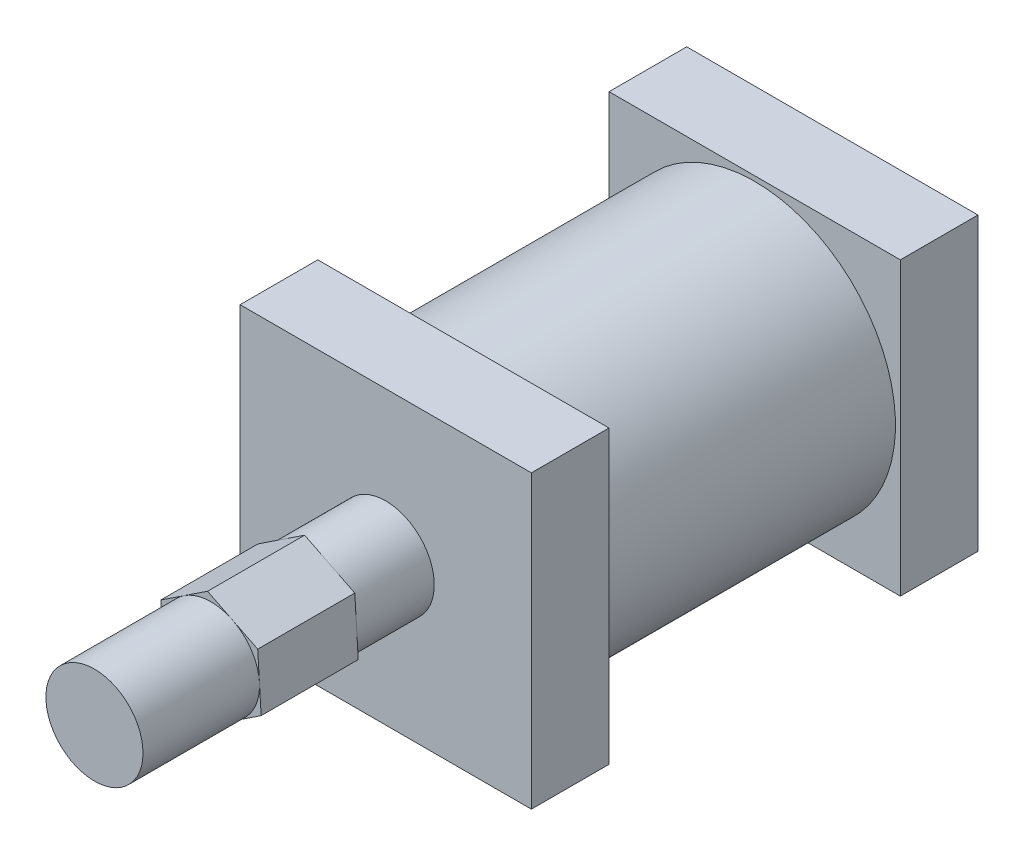
ISO-10303-21;
HEADER;
FILE_DESCRIPTION(('STEP AP214'),'2;1');
FILE_NAME('part.step','',(''),(''),'','','');
FILE_SCHEMA(('AUTOMOTIVE_DESIGN { 1 0 10303 214 1 1 1 1 }'));
ENDSEC;
DATA;
#1=APPLICATION_CONTEXT('core data for automotive mechanical design processes');
#2=APPLICATION_PROTOCOL_DEFINITION('international standard','automotive_design',2000,#1);
#3=PRODUCT_CONTEXT('',#1,'mechanical');
#4=PRODUCT('Part','Part','',(#3));
#5=PRODUCT_RELATED_PRODUCT_CATEGORY('part','',(#4));
#6=PRODUCT_DEFINITION_FORMATION('','',#4);
#7=PRODUCT_DEFINITION_CONTEXT('part definition',#1,'design');
#8=PRODUCT_DEFINITION('design','',#6,#7);
#9=PRODUCT_DEFINITION_SHAPE('','',#8);
#10=(LENGTH_UNIT() NAMED_UNIT(*) SI_UNIT(.MILLI.,.METRE.));
#11=(NAMED_UNIT(*) PLANE_ANGLE_UNIT() SI_UNIT($,.RADIAN.));
#12=(NAMED_UNIT(*) SI_UNIT($,.STERADIAN.) SOLID_ANGLE_UNIT());
#13=UNCERTAINTY_MEASURE_WITH_UNIT(LENGTH_MEASURE(1.E-05),#10,'distance_accuracy_value','');
#14=(GEOMETRIC_REPRESENTATION_CONTEXT(3) GLOBAL_UNCERTAINTY_ASSIGNED_CONTEXT((#13)) GLOBAL_UNIT_ASSIGNED_CONTEXT((#10,
#11,#12)) REPRESENTATION_CONTEXT('',''));
#15=CARTESIAN_POINT('',(0.,0.,0.));
#16=DIRECTION('',(0.,0.,1.));
#17=DIRECTION('',(1.,0.,0.));
#18=AXIS2_PLACEMENT_3D('',#15,#16,#17);
#19=CARTESIAN_POINT('',(0.,0.,81.28));
#20=DIRECTION('',(0.,0.,1.));
#21=DIRECTION('',(1.,0.,0.));
#22=AXIS2_PLACEMENT_3D('',#19,#20,#21);
#23=PLANE('',#22);
#24=CARTESIAN_POINT('',(19.05,19.05,81.28));
#25=DIRECTION('',(0.,0.,1.));
#26=DIRECTION('',(1.,0.,0.));
#27=AXIS2_PLACEMENT_3D('',#24,#25,#26);
#28=CIRCLE('',#27,6.35);
#29=CARTESIAN_POINT('',(25.3881327042533,19.4380384301526,81.28));
#30=VERTEX_POINT('',#29);
#31=CARTESIAN_POINT('',(21.8830152139698,24.7330031495166,81.28));
#32=VERTEX_POINT('',#31);
#33=EDGE_CURVE('E44',#30,#32,#28,.T.);
#34=ORIENTED_EDGE('',*,*,#33,.F.);
#35=DIRECTION('',(-0.0611084141972613,0.998131134528072,0.));
#36=VECTOR('',#35,1.);
#37=CARTESIAN_POINT('',(25.6121667963578,15.7787158071924,81.28));
#38=LINE('',#37,#36);
#39=CARTESIAN_POINT('',(25.1640986121487,23.0973610531128,81.28));
#40=VERTEX_POINT('',#39);
#41=EDGE_CURVE('E180',#30,#40,#38,.T.);
#42=ORIENTED_EDGE('',*,*,#41,.T.);
#43=DIRECTION('',(-0.894961125908124,0.446144128184226,0.));
#44=VECTOR('',#43,1.);
#45=CARTESIAN_POINT('',(25.1640986121487,23.0973610531128,81.28));
#46=LINE('',#45,#44);
#47=EDGE_CURVE('E193',#40,#32,#46,.T.);
#48=ORIENTED_EDGE('',*,*,#47,.T.);
#49=EDGE_LOOP('',(#34,#42,#48));
#50=FACE_BOUND('',#49,.T.);
#51=ADVANCED_FACE('F33',(#50),#23,.T.);
#52=CARTESIAN_POINT('',(15.5448825097166,24.344964719364,81.28));
#53=VERTEX_POINT('',#52);
#54=EDGE_CURVE('E11',#32,#53,#28,.T.);
#55=ORIENTED_EDGE('',*,*,#54,.F.);
#56=CARTESIAN_POINT('',(18.601931815791,26.3686452459204,81.28));
#57=VERTEX_POINT('',#56);
#58=EDGE_CURVE('E179',#32,#57,#46,.T.);
#59=ORIENTED_EDGE('',*,*,#58,.T.);
#60=DIRECTION('',(-0.833852711710863,-0.551987006343845,0.));
#61=VECTOR('',#60,1.);
#62=CARTESIAN_POINT('',(18.601931815791,26.3686452459204,81.28));
#63=LINE('',#62,#61);
#64=EDGE_CURVE('E205',#57,#53,#63,.T.);
#65=ORIENTED_EDGE('',*,*,#64,.T.);
#66=EDGE_LOOP('',(#55,#59,#65));
#67=FACE_BOUND('',#66,.T.);
#68=ADVANCED_FACE('F344',(#67),#23,.T.);
#69=CARTESIAN_POINT('',(12.7118672957468,18.6619615698474,81.28));
#70=VERTEX_POINT('',#69);
#71=EDGE_CURVE('E42',#53,#70,#28,.T.);
#72=ORIENTED_EDGE('',*,*,#71,.F.);
#73=CARTESIAN_POINT('',(12.4878332036422,22.3212841928076,81.28));
#74=VERTEX_POINT('',#73);
#75=EDGE_CURVE('E204',#53,#74,#63,.T.);
#76=ORIENTED_EDGE('',*,*,#75,.T.);
#77=DIRECTION('',(0.0611084141972611,-0.998131134528072,0.));
#78=VECTOR('',#77,1.);
#79=CARTESIAN_POINT('',(12.4878332036422,22.3212841928076,81.28));
#80=LINE('',#79,#78);
#81=EDGE_CURVE('E209',#74,#70,#80,.T.);
#82=ORIENTED_EDGE('',*,*,#81,.T.);
#83=EDGE_LOOP('',(#72,#76,#82));
#84=FACE_BOUND('',#83,.T.);
#85=ADVANCED_FACE('F349',(#84),#23,.T.);
#86=CARTESIAN_POINT('',(16.2169847860302,13.3669968504834,81.28));
#87=VERTEX_POINT('',#86);
#88=EDGE_CURVE('E198',#70,#87,#28,.T.);
#89=ORIENTED_EDGE('',*,*,#88,.F.);
#90=CARTESIAN_POINT('',(12.9359013878513,15.0026389468872,81.28));
#91=VERTEX_POINT('',#90);
#92=EDGE_CURVE('E208',#70,#91,#80,.T.);
#93=ORIENTED_EDGE('',*,*,#92,.T.);
#94=DIRECTION('',(0.894961125908124,-0.446144128184226,0.));
#95=VECTOR('',#94,1.);
#96=CARTESIAN_POINT('',(12.9359013878513,15.0026389468872,81.28));
#97=LINE('',#96,#95);
#98=EDGE_CURVE('E213',#91,#87,#97,.T.);
#99=ORIENTED_EDGE('',*,*,#98,.T.);
#100=EDGE_LOOP('',(#89,#93,#99));
#101=FACE_BOUND('',#100,.T.);
#102=ADVANCED_FACE('F365',(#101),#23,.T.);
#103=CARTESIAN_POINT('',(22.5551174902834,13.755035280636,81.28));
#104=VERTEX_POINT('',#103);
#105=EDGE_CURVE('E59',#87,#104,#28,.T.);
#106=ORIENTED_EDGE('',*,*,#105,.F.);
#107=CARTESIAN_POINT('',(19.4980681842091,11.7313547540796,81.28));
#108=VERTEX_POINT('',#107);
#109=EDGE_CURVE('E212',#87,#108,#97,.T.);
#110=ORIENTED_EDGE('',*,*,#109,.T.);
#111=DIRECTION('',(0.833852711710863,0.551987006343845,0.));
#112=VECTOR('',#111,1.);
#113=CARTESIAN_POINT('',(19.4980681842091,11.7313547540796,81.28));
#114=LINE('',#113,#112);
#115=EDGE_CURVE('E216',#108,#104,#114,.T.);
#116=ORIENTED_EDGE('',*,*,#115,.T.);
#117=EDGE_LOOP('',(#106,#110,#116));
#118=FACE_BOUND('',#117,.T.);
#119=ADVANCED_FACE('F338',(#118),#23,.T.);
#120=CARTESIAN_POINT('',(0.,0.,58.42));
#121=DIRECTION('',(0.,0.,-1.));
#122=DIRECTION('',(-1.,0.,0.));
#123=AXIS2_PLACEMENT_3D('',#120,#121,#122);
#124=PLANE('',#123);
#125=DIRECTION('',(0.,-1.,0.));
#126=VECTOR('',#125,1.);
#127=CARTESIAN_POINT('',(0.,0.,58.42));
#128=LINE('',#127,#126);
#129=CARTESIAN_POINT('',(0.,38.1,58.42));
#130=VERTEX_POINT('',#129);
#131=CARTESIAN_POINT('',(0.,0.,58.42));
#132=VERTEX_POINT('',#131);
#133=EDGE_CURVE('E261',#130,#132,#128,.T.);
#134=ORIENTED_EDGE('',*,*,#133,.T.);
#135=DIRECTION('',(1.,0.,0.));
#136=VECTOR('',#135,1.);
#137=CARTESIAN_POINT('',(0.,0.,58.42));
#138=LINE('',#137,#136);
#139=CARTESIAN_POINT('',(38.1,0.,58.42));
#140=VERTEX_POINT('',#139);
#141=EDGE_CURVE('E264',#132,#140,#138,.T.);
#142=ORIENTED_EDGE('',*,*,#141,.T.);
#143=DIRECTION('',(0.,1.,0.));
#144=VECTOR('',#143,1.);
#145=CARTESIAN_POINT('',(38.1,0.,58.42));
#146=LINE('',#145,#144);
#147=CARTESIAN_POINT('',(38.1,38.1,58.42));
#148=VERTEX_POINT('',#147);
#149=EDGE_CURVE('E267',#140,#148,#146,.T.);
#150=ORIENTED_EDGE('',*,*,#149,.T.);
#151=DIRECTION('',(-1.,0.,0.));
#152=VECTOR('',#151,1.);
#153=CARTESIAN_POINT('',(0.,38.1,58.42));
#154=LINE('',#153,#152);
#155=EDGE_CURVE('E269',#148,#130,#154,.T.);
#156=ORIENTED_EDGE('',*,*,#155,.T.);
#157=EDGE_LOOP('',(#134,#142,#150,#156));
#158=FACE_BOUND('',#157,.T.);
#159=CARTESIAN_POINT('',(19.05,19.05,58.42));
#160=DIRECTION('',(0.,0.,-1.));
#161=DIRECTION('',(-1.,0.,0.));
#162=AXIS2_PLACEMENT_3D('',#159,#160,#161);
#163=CIRCLE('',#162,6.35);
#164=CARTESIAN_POINT('',(12.7,19.05,58.42));
#165=VERTEX_POINT('',#164);
#166=EDGE_CURVE('E37',#165,#165,#163,.F.);
#167=ORIENTED_EDGE('',*,*,#166,.F.);
#168=EDGE_LOOP('',(#167));
#169=FACE_BOUND('',#168,.T.);
#170=ADVANCED_FACE('F329',(#158,#169),#124,.F.);
#171=CARTESIAN_POINT('',(0.,0.,10.16));
#172=DIRECTION('',(0.,0.,-1.));
#173=DIRECTION('',(-1.,0.,0.));
#174=AXIS2_PLACEMENT_3D('',#171,#172,#173);
#175=PLANE('',#174);
#176=DIRECTION('',(0.,-1.,0.));
#177=VECTOR('',#176,1.);
#178=CARTESIAN_POINT('',(0.,0.,10.16));
#179=LINE('',#178,#177);
#180=CARTESIAN_POINT('',(0.,38.1,10.16));
#181=VERTEX_POINT('',#180);
#182=CARTESIAN_POINT('',(0.,0.,10.16));
#183=VERTEX_POINT('',#182);
#184=EDGE_CURVE('E294',#181,#183,#179,.T.);
#185=ORIENTED_EDGE('',*,*,#184,.T.);
#186=DIRECTION('',(1.,0.,0.));
#187=VECTOR('',#186,1.);
#188=CARTESIAN_POINT('',(0.,0.,10.16));
#189=LINE('',#188,#187);
#190=CARTESIAN_POINT('',(38.1,0.,10.16));
#191=VERTEX_POINT('',#190);
#192=EDGE_CURVE('E297',#183,#191,#189,.T.);
#193=ORIENTED_EDGE('',*,*,#192,.T.);
#194=DIRECTION('',(0.,1.,0.));
#195=VECTOR('',#194,1.);
#196=CARTESIAN_POINT('',(38.1,0.,10.16));
#197=LINE('',#196,#195);
#198=CARTESIAN_POINT('',(38.1,38.1,10.16));
#199=VERTEX_POINT('',#198);
#200=EDGE_CURVE('E300',#191,#199,#197,.T.);
#201=ORIENTED_EDGE('',*,*,#200,.T.);
#202=DIRECTION('',(-1.,0.,0.));
#203=VECTOR('',#202,1.);
#204=CARTESIAN_POINT('',(0.,38.1,10.16));
#205=LINE('',#204,#203);
#206=EDGE_CURVE('E302',#199,#181,#205,.T.);
#207=ORIENTED_EDGE('',*,*,#206,.T.);
#208=EDGE_LOOP('',(#185,#193,#201,#207));
#209=FACE_BOUND('',#208,.T.);
#210=CARTESIAN_POINT('',(19.05,19.05,10.16));
#211=DIRECTION('',(0.,0.,-1.));
#212=DIRECTION('',(-1.,0.,0.));
#213=AXIS2_PLACEMENT_3D('',#210,#211,#212);
#214=CIRCLE('',#213,18.415);
#215=CARTESIAN_POINT('',(0.635000000000007,19.05,10.16));
#216=VERTEX_POINT('',#215);
#217=EDGE_CURVE('E200',#216,#216,#214,.F.);
#218=ORIENTED_EDGE('',*,*,#217,.F.);
#219=EDGE_LOOP('',(#218));
#220=FACE_BOUND('',#219,.T.);
#221=ADVANCED_FACE('F327',(#209,#220),#175,.F.);
#222=CARTESIAN_POINT('',(0.,0.,10.16));
#223=DIRECTION('',(1.,0.,0.));
#224=DIRECTION('',(0.,0.,-1.));
#225=AXIS2_PLACEMENT_3D('',#222,#223,#224);
#226=PLANE('',#225);
#227=DIRECTION('',(0.,-1.,0.));
#228=VECTOR('',#227,1.);
#229=CARTESIAN_POINT('',(0.,0.,0.));
#230=LINE('',#229,#228);
#231=CARTESIAN_POINT('',(0.,38.1,0.));
#232=VERTEX_POINT('',#231);
#233=CARTESIAN_POINT('',(0.,0.,0.));
#234=VERTEX_POINT('',#233);
#235=EDGE_CURVE('E293',#232,#234,#230,.T.);
#236=ORIENTED_EDGE('',*,*,#235,.T.);
#237=DIRECTION('',(0.,0.,-1.));
#238=VECTOR('',#237,1.);
#239=CARTESIAN_POINT('',(0.,0.,10.16));
#240=LINE('',#239,#238);
#241=EDGE_CURVE('E320',#183,#234,#240,.T.);
#242=ORIENTED_EDGE('',*,*,#241,.F.);
#243=ORIENTED_EDGE('',*,*,#184,.F.);
#244=DIRECTION('',(0.,0.,-1.));
#245=VECTOR('',#244,1.);
#246=CARTESIAN_POINT('',(0.,38.1,10.16));
#247=LINE('',#246,#245);
#248=EDGE_CURVE('E304',#181,#232,#247,.T.);
#249=ORIENTED_EDGE('',*,*,#248,.T.);
#250=EDGE_LOOP('',(#236,#242,#243,#249));
#251=FACE_BOUND('',#250,.T.);
#252=ADVANCED_FACE('F35',(#251),#226,.F.);
#253=CARTESIAN_POINT('',(0.,0.,10.16));
#254=DIRECTION('',(0.,1.,0.));
#255=DIRECTION('',(0.,0.,1.));
#256=AXIS2_PLACEMENT_3D('',#253,#254,#255);
#257=PLANE('',#256);
#258=DIRECTION('',(1.,0.,0.));
#259=VECTOR('',#258,1.);
#260=CARTESIAN_POINT('',(0.,0.,0.));
#261=LINE('',#260,#259);
#262=CARTESIAN_POINT('',(38.1,0.,0.));
#263=VERTEX_POINT('',#262);
#264=EDGE_CURVE('E307',#234,#263,#261,.T.);
#265=ORIENTED_EDGE('',*,*,#264,.T.);
#266=DIRECTION('',(0.,0.,-1.));
#267=VECTOR('',#266,1.);
#268=CARTESIAN_POINT('',(38.1,0.,10.16));
#269=LINE('',#268,#267);
#270=EDGE_CURVE('E317',#191,#263,#269,.T.);
#271=ORIENTED_EDGE('',*,*,#270,.F.);
#272=ORIENTED_EDGE('',*,*,#192,.F.);
#273=ORIENTED_EDGE('',*,*,#241,.T.);
#274=EDGE_LOOP('',(#265,#271,#272,#273));
#275=FACE_BOUND('',#274,.T.);
#276=ADVANCED_FACE('F336',(#275),#257,.F.);
#277=CARTESIAN_POINT('',(38.1,0.,10.16));
#278=DIRECTION('',(-1.,0.,0.));
#279=DIRECTION('',(0.,0.,1.));
#280=AXIS2_PLACEMENT_3D('',#277,#278,#279);
#281=PLANE('',#280);
#282=DIRECTION('',(0.,1.,0.));
#283=VECTOR('',#282,1.);
#284=CARTESIAN_POINT('',(38.1,0.,0.));
#285=LINE('',#284,#283);
#286=CARTESIAN_POINT('',(38.1,38.1,0.));
#287=VERTEX_POINT('',#286);
#288=EDGE_CURVE('E309',#263,#287,#285,.T.);
#289=ORIENTED_EDGE('',*,*,#288,.T.);
#290=DIRECTION('',(0.,0.,-1.));
#291=VECTOR('',#290,1.);
#292=CARTESIAN_POINT('',(38.1,38.1,10.16));
#293=LINE('',#292,#291);
#294=EDGE_CURVE('E314',#199,#287,#293,.T.);
#295=ORIENTED_EDGE('',*,*,#294,.F.);
#296=ORIENTED_EDGE('',*,*,#200,.F.);
#297=ORIENTED_EDGE('',*,*,#270,.T.);
#298=EDGE_LOOP('',(#289,#295,#296,#297));
#299=FACE_BOUND('',#298,.T.);
#300=ADVANCED_FACE('F649',(#299),#281,.F.);
#301=CARTESIAN_POINT('',(0.,38.1,10.16));
#302=DIRECTION('',(0.,-1.,0.));
#303=DIRECTION('',(0.,0.,-1.));
#304=AXIS2_PLACEMENT_3D('',#301,#302,#303);
#305=PLANE('',#304);
#306=DIRECTION('',(-1.,0.,0.));
#307=VECTOR('',#306,1.);
#308=CARTESIAN_POINT('',(0.,38.1,0.));
#309=LINE('',#308,#307);
#310=EDGE_CURVE('E298',#287,#232,#309,.T.);
#311=ORIENTED_EDGE('',*,*,#310,.T.);
#312=ORIENTED_EDGE('',*,*,#248,.F.);
#313=ORIENTED_EDGE('',*,*,#206,.F.);
#314=ORIENTED_EDGE('',*,*,#294,.T.);
#315=EDGE_LOOP('',(#311,#312,#313,#314));
#316=FACE_BOUND('',#315,.T.);
#317=ADVANCED_FACE('F640',(#316),#305,.F.);
#318=CARTESIAN_POINT('',(0.,0.,0.));
#319=DIRECTION('',(0.,0.,-1.));
#320=DIRECTION('',(-1.,0.,0.));
#321=AXIS2_PLACEMENT_3D('',#318,#319,#320);
#322=PLANE('',#321);
#323=ORIENTED_EDGE('',*,*,#235,.F.);
#324=ORIENTED_EDGE('',*,*,#310,.F.);
#325=ORIENTED_EDGE('',*,*,#288,.F.);
#326=ORIENTED_EDGE('',*,*,#264,.F.);
#327=EDGE_LOOP('',(#323,#324,#325,#326));
#328=FACE_BOUND('',#327,.T.);
#329=ADVANCED_FACE('F626',(#328),#322,.T.);
#330=CARTESIAN_POINT('',(19.05,19.05,48.26));
#331=DIRECTION('',(0.,0.,-1.));
#332=DIRECTION('',(-1.,0.,0.));
#333=AXIS2_PLACEMENT_3D('',#330,#331,#332);
#334=CYLINDRICAL_SURFACE('',#333,18.415);
#335=CARTESIAN_POINT('',(19.05,19.05,48.26));
#336=DIRECTION('',(0.,0.,1.));
#337=DIRECTION('',(1.,0.,0.));
#338=AXIS2_PLACEMENT_3D('',#335,#336,#337);
#339=CIRCLE('',#338,18.415);
#340=CARTESIAN_POINT('',(0.635000000000007,19.05,48.26));
#341=VERTEX_POINT('',#340);
#342=EDGE_CURVE('E290',#341,#341,#339,.T.);
#343=CARTESIAN_POINT('',(0.635000000000007,19.05,48.26));
#344=CARTESIAN_POINT('',(0.635000000000007,19.05,47.863125));
#345=CARTESIAN_POINT('',(0.635000000000007,19.05,47.46625));
#346=CARTESIAN_POINT('',(0.635000000000007,19.05,46.6725));
#347=CARTESIAN_POINT('',(0.635000000000007,19.05,46.275625));
#348=CARTESIAN_POINT('',(0.635000000000007,19.05,45.481875));
#349=CARTESIAN_POINT('',(0.635000000000007,19.05,45.085));
#350=CARTESIAN_POINT('',(0.635000000000007,19.05,44.29125));
#351=CARTESIAN_POINT('',(0.635000000000007,19.05,43.894375));
#352=CARTESIAN_POINT('',(0.635000000000007,19.05,43.100625));
#353=CARTESIAN_POINT('',(0.635000000000007,19.05,42.70375));
#354=CARTESIAN_POINT('',(0.635000000000007,19.05,41.91));
#355=CARTESIAN_POINT('',(0.635000000000007,19.05,41.513125));
#356=CARTESIAN_POINT('',(0.635000000000007,19.05,40.719375));
#357=CARTESIAN_POINT('',(0.635000000000007,19.05,40.3225));
#358=CARTESIAN_POINT('',(0.635000000000007,19.05,39.52875));
#359=CARTESIAN_POINT('',(0.635000000000007,19.05,39.131875));
#360=CARTESIAN_POINT('',(0.635000000000007,19.05,38.338125));
#361=CARTESIAN_POINT('',(0.635000000000007,19.05,37.94125));
#362=CARTESIAN_POINT('',(0.635000000000007,19.05,37.1475));
#363=CARTESIAN_POINT('',(0.635000000000007,19.05,36.750625));
#364=CARTESIAN_POINT('',(0.635000000000007,19.05,35.956875));
#365=CARTESIAN_POINT('',(0.635000000000007,19.05,35.56));
#366=CARTESIAN_POINT('',(0.635000000000007,19.05,34.76625));
#367=CARTESIAN_POINT('',(0.635000000000007,19.05,34.369375));
#368=CARTESIAN_POINT('',(0.635000000000007,19.05,33.575625));
#369=CARTESIAN_POINT('',(0.635000000000007,19.05,33.17875));
#370=CARTESIAN_POINT('',(0.635000000000007,19.05,32.385));
#371=CARTESIAN_POINT('',(0.635000000000007,19.05,31.988125));
#372=CARTESIAN_POINT('',(0.635000000000007,19.05,31.194375));
#373=CARTESIAN_POINT('',(0.635000000000007,19.05,30.7975));
#374=CARTESIAN_POINT('',(0.635000000000007,19.05,30.00375));
#375=CARTESIAN_POINT('',(0.635000000000007,19.05,29.606875));
#376=CARTESIAN_POINT('',(0.635000000000007,19.05,28.813125));
#377=CARTESIAN_POINT('',(0.635000000000007,19.05,28.41625));
#378=CARTESIAN_POINT('',(0.635000000000007,19.05,27.6225));
#379=CARTESIAN_POINT('',(0.635000000000007,19.05,27.225625));
#380=CARTESIAN_POINT('',(0.635000000000007,19.05,26.431875));
#381=CARTESIAN_POINT('',(0.635000000000007,19.05,26.035));
#382=CARTESIAN_POINT('',(0.635000000000007,19.05,25.24125));
#383=CARTESIAN_POINT('',(0.635000000000007,19.05,24.844375));
#384=CARTESIAN_POINT('',(0.635000000000007,19.05,24.050625));
#385=CARTESIAN_POINT('',(0.635000000000007,19.05,23.65375));
#386=CARTESIAN_POINT('',(0.635000000000007,19.05,22.86));
#387=CARTESIAN_POINT('',(0.635000000000007,19.05,22.463125));
#388=CARTESIAN_POINT('',(0.635000000000007,19.05,21.669375));
#389=CARTESIAN_POINT('',(0.635000000000007,19.05,21.2725));
#390=CARTESIAN_POINT('',(0.635000000000007,19.05,20.47875));
#391=CARTESIAN_POINT('',(0.635000000000007,19.05,20.081875));
#392=CARTESIAN_POINT('',(0.635000000000007,19.05,19.288125));
#393=CARTESIAN_POINT('',(0.635000000000007,19.05,18.89125));
#394=CARTESIAN_POINT('',(0.635000000000007,19.05,18.0975));
#395=CARTESIAN_POINT('',(0.635000000000007,19.05,17.700625));
#396=CARTESIAN_POINT('',(0.635000000000007,19.05,16.906875));
#397=CARTESIAN_POINT('',(0.635000000000007,19.05,16.51));
#398=CARTESIAN_POINT('',(0.635000000000007,19.05,15.71625));
#399=CARTESIAN_POINT('',(0.635000000000007,19.05,15.319375));
#400=CARTESIAN_POINT('',(0.635000000000007,19.05,14.525625));
#401=CARTESIAN_POINT('',(0.635000000000007,19.05,14.12875));
#402=CARTESIAN_POINT('',(0.635000000000007,19.05,13.335));
#403=CARTESIAN_POINT('',(0.635000000000007,19.05,12.938125));
#404=CARTESIAN_POINT('',(0.635000000000007,19.05,12.144375));
#405=CARTESIAN_POINT('',(0.635000000000007,19.05,11.7475));
#406=CARTESIAN_POINT('',(0.635000000000007,19.05,10.95375));
#407=CARTESIAN_POINT('',(0.635000000000007,19.05,10.556875));
#408=CARTESIAN_POINT('',(0.635000000000007,19.05,10.16));
#409=B_SPLINE_CURVE_WITH_KNOTS('',3,(#343,#344,#345,#346,#347,#348,#349,#350,#351,#352,#353,
#354,#355,#356,#357,#358,#359,#360,#361,#362,#363,#364,#365,#366,#367,#368,#369,#370,#371,#372,
#373,#374,#375,#376,#377,#378,#379,#380,#381,#382,#383,#384,#385,#386,#387,#388,#389,#390,#391,
#392,#393,#394,#395,#396,#397,#398,#399,#400,#401,#402,#403,#404,#405,#406,#407,#408),
.UNSPECIFIED.,.F.,.F.,(4,2,2,2,2,2,2,2,2,2,2,2,2,2,2,2,2,2,2,2,2,2,2,2,2,2,2,2,2,2,2,2,4),(0.,
1.19062499999999,2.38124999999999,3.571875,4.7625,5.953125,7.14375,8.33437499999999,
9.52499999999999,10.715625,11.90625,13.096875,14.2875,15.478125,16.66875,17.859375,19.05,
20.240625,21.43125,22.621875,23.8125,25.003125,26.19375,27.384375,28.575,29.765625,30.95625,
32.146875,33.3375,34.528125,35.71875,36.909375,38.1),.UNSPECIFIED.);
#410=EDGE_CURVE('BSEAM325',#341,#216,#409,.T.);
#411=ORIENTED_EDGE('',*,*,#342,.F.);
#412=ORIENTED_EDGE('',*,*,#217,.T.);
#413=ORIENTED_EDGE('',*,*,#410,.T.);
#414=ORIENTED_EDGE('',*,*,#410,.F.);
#415=EDGE_LOOP('',(#411,#413,#412,#414));
#416=FACE_BOUND('',#415,.T.);
#417=ADVANCED_FACE('F325',(#416),#334,.T.);
#418=CARTESIAN_POINT('',(0.,0.,48.26));
#419=DIRECTION('',(0.,0.,-1.));
#420=DIRECTION('',(-1.,0.,0.));
#421=AXIS2_PLACEMENT_3D('',#418,#419,#420);
#422=PLANE('',#421);
#423=DIRECTION('',(0.,-1.,0.));
#424=VECTOR('',#423,1.);
#425=CARTESIAN_POINT('',(0.,0.,48.26));
#426=LINE('',#425,#424);
#427=CARTESIAN_POINT('',(0.,38.1,48.26));
#428=VERTEX_POINT('',#427);
#429=CARTESIAN_POINT('',(0.,0.,48.26));
#430=VERTEX_POINT('',#429);
#431=EDGE_CURVE('E259',#428,#430,#426,.T.);
#432=ORIENTED_EDGE('',*,*,#431,.F.);
#433=DIRECTION('',(-1.,0.,0.));
#434=VECTOR('',#433,1.);
#435=CARTESIAN_POINT('',(0.,38.1,48.26));
#436=LINE('',#435,#434);
#437=CARTESIAN_POINT('',(38.1,38.1,48.26));
#438=VERTEX_POINT('',#437);
#439=EDGE_CURVE('E265',#438,#428,#436,.T.);
#440=ORIENTED_EDGE('',*,*,#439,.F.);
#441=DIRECTION('',(0.,1.,0.));
#442=VECTOR('',#441,1.);
#443=CARTESIAN_POINT('',(38.1,0.,48.26));
#444=LINE('',#443,#442);
#445=CARTESIAN_POINT('',(38.1,0.,48.26));
#446=VERTEX_POINT('',#445);
#447=EDGE_CURVE('E276',#446,#438,#444,.T.);
#448=ORIENTED_EDGE('',*,*,#447,.F.);
#449=DIRECTION('',(1.,0.,0.));
#450=VECTOR('',#449,1.);
#451=CARTESIAN_POINT('',(0.,0.,48.26));
#452=LINE('',#451,#450);
#453=EDGE_CURVE('E274',#430,#446,#452,.T.);
#454=ORIENTED_EDGE('',*,*,#453,.F.);
#455=EDGE_LOOP('',(#432,#440,#448,#454));
#456=FACE_BOUND('',#455,.T.);
#457=ORIENTED_EDGE('',*,*,#342,.T.);
#458=EDGE_LOOP('',(#457));
#459=FACE_BOUND('',#458,.T.);
#460=ADVANCED_FACE('F608',(#456,#459),#422,.T.);
#461=CARTESIAN_POINT('',(0.,0.,58.42));
#462=DIRECTION('',(1.,0.,0.));
#463=DIRECTION('',(0.,0.,-1.));
#464=AXIS2_PLACEMENT_3D('',#461,#462,#463);
#465=PLANE('',#464);
#466=ORIENTED_EDGE('',*,*,#431,.T.);
#467=DIRECTION('',(0.,0.,-1.));
#468=VECTOR('',#467,1.);
#469=CARTESIAN_POINT('',(0.,0.,58.42));
#470=LINE('',#469,#468);
#471=EDGE_CURVE('E287',#132,#430,#470,.T.);
#472=ORIENTED_EDGE('',*,*,#471,.F.);
#473=ORIENTED_EDGE('',*,*,#133,.F.);
#474=DIRECTION('',(0.,0.,-1.));
#475=VECTOR('',#474,1.);
#476=CARTESIAN_POINT('',(0.,38.1,58.42));
#477=LINE('',#476,#475);
#478=EDGE_CURVE('E271',#130,#428,#477,.T.);
#479=ORIENTED_EDGE('',*,*,#478,.T.);
#480=EDGE_LOOP('',(#466,#472,#473,#479));
#481=FACE_BOUND('',#480,.T.);
#482=ADVANCED_FACE('F598',(#481),#465,.F.);
#483=CARTESIAN_POINT('',(0.,0.,58.42));
#484=DIRECTION('',(0.,1.,0.));
#485=DIRECTION('',(0.,0.,1.));
#486=AXIS2_PLACEMENT_3D('',#483,#484,#485);
#487=PLANE('',#486);
#488=ORIENTED_EDGE('',*,*,#453,.T.);
#489=DIRECTION('',(0.,0.,-1.));
#490=VECTOR('',#489,1.);
#491=CARTESIAN_POINT('',(38.1,0.,58.42));
#492=LINE('',#491,#490);
#493=EDGE_CURVE('E284',#140,#446,#492,.T.);
#494=ORIENTED_EDGE('',*,*,#493,.F.);
#495=ORIENTED_EDGE('',*,*,#141,.F.);
#496=ORIENTED_EDGE('',*,*,#471,.T.);
#497=EDGE_LOOP('',(#488,#494,#495,#496));
#498=FACE_BOUND('',#497,.T.);
#499=ADVANCED_FACE('F588',(#498),#487,.F.);
#500=CARTESIAN_POINT('',(38.1,0.,58.42));
#501=DIRECTION('',(-1.,0.,0.));
#502=DIRECTION('',(0.,0.,1.));
#503=AXIS2_PLACEMENT_3D('',#500,#501,#502);
#504=PLANE('',#503);
#505=ORIENTED_EDGE('',*,*,#447,.T.);
#506=DIRECTION('',(0.,0.,-1.));
#507=VECTOR('',#506,1.);
#508=CARTESIAN_POINT('',(38.1,38.1,58.42));
#509=LINE('',#508,#507);
#510=EDGE_CURVE('E281',#148,#438,#509,.T.);
#511=ORIENTED_EDGE('',*,*,#510,.F.);
#512=ORIENTED_EDGE('',*,*,#149,.F.);
#513=ORIENTED_EDGE('',*,*,#493,.T.);
#514=EDGE_LOOP('',(#505,#511,#512,#513));
#515=FACE_BOUND('',#514,.T.);
#516=ADVANCED_FACE('F578',(#515),#504,.F.);
#517=CARTESIAN_POINT('',(0.,38.1,58.42));
#518=DIRECTION('',(0.,-1.,0.));
#519=DIRECTION('',(0.,0.,-1.));
#520=AXIS2_PLACEMENT_3D('',#517,#518,#519);
#521=PLANE('',#520);
#522=ORIENTED_EDGE('',*,*,#439,.T.);
#523=ORIENTED_EDGE('',*,*,#478,.F.);
#524=ORIENTED_EDGE('',*,*,#155,.F.);
#525=ORIENTED_EDGE('',*,*,#510,.T.);
#526=EDGE_LOOP('',(#522,#523,#524,#525));
#527=FACE_BOUND('',#526,.T.);
#528=ADVANCED_FACE('F563',(#527),#521,.F.);
#529=CARTESIAN_POINT('',(19.05,19.05,68.58));
#530=DIRECTION('',(0.,0.,-1.));
#531=DIRECTION('',(-1.,0.,0.));
#532=AXIS2_PLACEMENT_3D('',#529,#530,#531);
#533=CYLINDRICAL_SURFACE('',#532,6.35);
#534=CARTESIAN_POINT('',(19.05,19.05,68.58));
#535=DIRECTION('',(0.,0.,1.));
#536=DIRECTION('',(1.,0.,0.));
#537=AXIS2_PLACEMENT_3D('',#534,#535,#536);
#538=CIRCLE('',#537,6.35);
#539=CARTESIAN_POINT('',(25.3881327042532,19.4380384301526,68.58));
#540=VERTEX_POINT('',#539);
#541=CARTESIAN_POINT('',(21.8830152139698,24.7330031495166,68.58));
#542=VERTEX_POINT('',#541);
#543=EDGE_CURVE('E256',#540,#542,#538,.T.);
#544=ORIENTED_EDGE('',*,*,#543,.F.);
#545=CARTESIAN_POINT('',(22.5551174902834,13.755035280636,68.58));
#546=VERTEX_POINT('',#545);
#547=EDGE_CURVE('E255',#546,#540,#538,.T.);
#548=ORIENTED_EDGE('',*,*,#547,.F.);
#549=CARTESIAN_POINT('',(16.2169847860302,13.3669968504834,68.58));
#550=VERTEX_POINT('',#549);
#551=EDGE_CURVE('E418',#550,#546,#538,.T.);
#552=ORIENTED_EDGE('',*,*,#551,.F.);
#553=CARTESIAN_POINT('',(12.7118672957468,18.6619615698474,68.58));
#554=VERTEX_POINT('',#553);
#555=EDGE_CURVE('E401',#554,#550,#538,.T.);
#556=ORIENTED_EDGE('',*,*,#555,.F.);
#557=CARTESIAN_POINT('',(15.5448825097166,24.344964719364,68.58));
#558=VERTEX_POINT('',#557);
#559=EDGE_CURVE('E397',#558,#554,#538,.T.);
#560=ORIENTED_EDGE('',*,*,#559,.F.);
#561=EDGE_CURVE('E260',#542,#558,#538,.T.);
#562=ORIENTED_EDGE('',*,*,#561,.F.);
#563=EDGE_LOOP('',(#544,#548,#552,#556,#560,#562));
#564=FACE_BOUND('',#563,.T.);
#565=ORIENTED_EDGE('',*,*,#166,.T.);
#566=EDGE_LOOP('',(#565));
#567=FACE_BOUND('',#566,.T.);
#568=ADVANCED_FACE('F555',(#564,#567),#533,.T.);
#569=CARTESIAN_POINT('',(0.,0.,68.58));
#570=DIRECTION('',(0.,0.,1.));
#571=DIRECTION('',(1.,0.,0.));
#572=AXIS2_PLACEMENT_3D('',#569,#570,#571);
#573=PLANE('',#572);
#574=DIRECTION('',(-0.0611084141972613,0.998131134528072,0.));
#575=VECTOR('',#574,1.);
#576=CARTESIAN_POINT('',(25.6121667963578,15.7787158071924,68.58));
#577=LINE('',#576,#575);
#578=CARTESIAN_POINT('',(25.1640986121487,23.0973610531128,68.58));
#579=VERTEX_POINT('',#578);
#580=EDGE_CURVE('E222',#540,#579,#577,.T.);
#581=ORIENTED_EDGE('',*,*,#580,.F.);
#582=ORIENTED_EDGE('',*,*,#543,.T.);
#583=DIRECTION('',(-0.894961125908124,0.446144128184226,0.));
#584=VECTOR('',#583,1.);
#585=CARTESIAN_POINT('',(25.1640986121487,23.0973610531128,68.58));
#586=LINE('',#585,#584);
#587=EDGE_CURVE('E223',#579,#542,#586,.T.);
#588=ORIENTED_EDGE('',*,*,#587,.F.);
#589=EDGE_LOOP('',(#581,#582,#588));
#590=FACE_BOUND('',#589,.T.);
#591=ADVANCED_FACE('F421',(#590),#573,.F.);
#592=CARTESIAN_POINT('',(18.601931815791,26.3686452459204,68.58));
#593=VERTEX_POINT('',#592);
#594=EDGE_CURVE('E221',#542,#593,#586,.T.);
#595=ORIENTED_EDGE('',*,*,#594,.F.);
#596=ORIENTED_EDGE('',*,*,#561,.T.);
#597=DIRECTION('',(-0.833852711710863,-0.551987006343845,0.));
#598=VECTOR('',#597,1.);
#599=CARTESIAN_POINT('',(18.601931815791,26.3686452459204,68.58));
#600=LINE('',#599,#598);
#601=EDGE_CURVE('E227',#593,#558,#600,.T.);
#602=ORIENTED_EDGE('',*,*,#601,.F.);
#603=EDGE_LOOP('',(#595,#596,#602));
#604=FACE_BOUND('',#603,.T.);
#605=ADVANCED_FACE('F539',(#604),#573,.F.);
#606=CARTESIAN_POINT('',(12.4878332036422,22.3212841928076,68.58));
#607=VERTEX_POINT('',#606);
#608=EDGE_CURVE('E226',#558,#607,#600,.T.);
#609=ORIENTED_EDGE('',*,*,#608,.F.);
#610=ORIENTED_EDGE('',*,*,#559,.T.);
#611=DIRECTION('',(0.0611084141972611,-0.998131134528072,0.));
#612=VECTOR('',#611,1.);
#613=CARTESIAN_POINT('',(12.4878332036422,22.3212841928076,68.58));
#614=LINE('',#613,#612);
#615=EDGE_CURVE('E231',#607,#554,#614,.T.);
#616=ORIENTED_EDGE('',*,*,#615,.F.);
#617=EDGE_LOOP('',(#609,#610,#616));
#618=FACE_BOUND('',#617,.T.);
#619=ADVANCED_FACE('F396',(#618),#573,.F.);
#620=CARTESIAN_POINT('',(12.9359013878513,15.0026389468872,68.58));
#621=VERTEX_POINT('',#620);
#622=EDGE_CURVE('E230',#554,#621,#614,.T.);
#623=ORIENTED_EDGE('',*,*,#622,.F.);
#624=ORIENTED_EDGE('',*,*,#555,.T.);
#625=DIRECTION('',(0.894961125908124,-0.446144128184226,0.));
#626=VECTOR('',#625,1.);
#627=CARTESIAN_POINT('',(12.9359013878513,15.0026389468872,68.58));
#628=LINE('',#627,#626);
#629=EDGE_CURVE('E235',#621,#550,#628,.T.);
#630=ORIENTED_EDGE('',*,*,#629,.F.);
#631=EDGE_LOOP('',(#623,#624,#630));
#632=FACE_BOUND('',#631,.T.);
#633=ADVANCED_FACE('F405',(#632),#573,.F.);
#634=CARTESIAN_POINT('',(19.4980681842091,11.7313547540796,68.58));
#635=VERTEX_POINT('',#634);
#636=EDGE_CURVE('E234',#550,#635,#628,.T.);
#637=ORIENTED_EDGE('',*,*,#636,.F.);
#638=ORIENTED_EDGE('',*,*,#551,.T.);
#639=DIRECTION('',(0.833852711710863,0.551987006343845,0.));
#640=VECTOR('',#639,1.);
#641=CARTESIAN_POINT('',(19.4980681842091,11.7313547540796,68.58));
#642=LINE('',#641,#640);
#643=EDGE_CURVE('E191',#635,#546,#642,.T.);
#644=ORIENTED_EDGE('',*,*,#643,.F.);
#645=EDGE_LOOP('',(#637,#638,#644));
#646=FACE_BOUND('',#645,.T.);
#647=ADVANCED_FACE('F516',(#646),#573,.F.);
#648=CARTESIAN_POINT('',(25.6121667963578,15.7787158071924,68.58));
#649=VERTEX_POINT('',#648);
#650=EDGE_CURVE('E238',#546,#649,#642,.T.);
#651=ORIENTED_EDGE('',*,*,#650,.F.);
#652=ORIENTED_EDGE('',*,*,#547,.T.);
#653=EDGE_CURVE('E219',#649,#540,#577,.T.);
#654=ORIENTED_EDGE('',*,*,#653,.F.);
#655=EDGE_LOOP('',(#651,#652,#654));
#656=FACE_BOUND('',#655,.T.);
#657=ADVANCED_FACE('F415',(#656),#573,.F.);
#658=CARTESIAN_POINT('',(25.6121667963578,15.7787158071924,81.28));
#659=DIRECTION('',(-0.998131134528072,-0.0611084141972613,0.));
#660=DIRECTION('',(0.0611084141972613,-0.998131134528072,0.));
#661=AXIS2_PLACEMENT_3D('',#658,#659,#660);
#662=PLANE('',#661);
#663=ORIENTED_EDGE('',*,*,#653,.T.);
#664=ORIENTED_EDGE('',*,*,#580,.T.);
#665=DIRECTION('',(0.,0.,-1.));
#666=VECTOR('',#665,1.);
#667=CARTESIAN_POINT('',(25.1640986121487,23.0973610531128,81.28));
#668=LINE('',#667,#666);
#669=EDGE_CURVE('E187',#40,#579,#668,.T.);
#670=ORIENTED_EDGE('',*,*,#669,.F.);
#671=ORIENTED_EDGE('',*,*,#41,.F.);
#672=CARTESIAN_POINT('',(25.6121667963578,15.7787158071924,81.28));
#673=VERTEX_POINT('',#672);
#674=EDGE_CURVE('E172',#673,#30,#38,.T.);
#675=ORIENTED_EDGE('',*,*,#674,.F.);
#676=DIRECTION('',(0.,0.,-1.));
#677=VECTOR('',#676,1.);
#678=CARTESIAN_POINT('',(25.6121667963578,15.7787158071924,81.28));
#679=LINE('',#678,#677);
#680=EDGE_CURVE('E218',#673,#649,#679,.T.);
#681=ORIENTED_EDGE('',*,*,#680,.T.);
#682=EDGE_LOOP('',(#663,#664,#670,#671,#675,#681));
#683=FACE_BOUND('',#682,.T.);
#684=ADVANCED_FACE('F185',(#683),#662,.F.);
#685=CARTESIAN_POINT('',(25.1640986121487,23.0973610531128,81.28));
#686=DIRECTION('',(-0.446144128184226,-0.894961125908124,0.));
#687=DIRECTION('',(0.894961125908124,-0.446144128184226,0.));
#688=AXIS2_PLACEMENT_3D('',#685,#686,#687);
#689=PLANE('',#688);
#690=ORIENTED_EDGE('',*,*,#587,.T.);
#691=ORIENTED_EDGE('',*,*,#594,.T.);
#692=DIRECTION('',(0.,0.,-1.));
#693=VECTOR('',#692,1.);
#694=CARTESIAN_POINT('',(18.601931815791,26.3686452459204,81.28));
#695=LINE('',#694,#693);
#696=EDGE_CURVE('E251',#57,#593,#695,.T.);
#697=ORIENTED_EDGE('',*,*,#696,.F.);
#698=ORIENTED_EDGE('',*,*,#58,.F.);
#699=ORIENTED_EDGE('',*,*,#47,.F.);
#700=ORIENTED_EDGE('',*,*,#669,.T.);
#701=EDGE_LOOP('',(#690,#691,#697,#698,#699,#700));
#702=FACE_BOUND('',#701,.T.);
#703=ADVANCED_FACE('F387',(#702),#689,.F.);
#704=CARTESIAN_POINT('',(18.601931815791,26.3686452459204,81.28));
#705=DIRECTION('',(0.551987006343845,-0.833852711710863,0.));
#706=DIRECTION('',(0.833852711710863,0.551987006343845,0.));
#707=AXIS2_PLACEMENT_3D('',#704,#705,#706);
#708=PLANE('',#707);
#709=ORIENTED_EDGE('',*,*,#601,.T.);
#710=ORIENTED_EDGE('',*,*,#608,.T.);
#711=DIRECTION('',(0.,0.,-1.));
#712=VECTOR('',#711,1.);
#713=CARTESIAN_POINT('',(12.4878332036422,22.3212841928076,81.28));
#714=LINE('',#713,#712);
#715=EDGE_CURVE('E248',#74,#607,#714,.T.);
#716=ORIENTED_EDGE('',*,*,#715,.F.);
#717=ORIENTED_EDGE('',*,*,#75,.F.);
#718=ORIENTED_EDGE('',*,*,#64,.F.);
#719=ORIENTED_EDGE('',*,*,#696,.T.);
#720=EDGE_LOOP('',(#709,#710,#716,#717,#718,#719));
#721=FACE_BOUND('',#720,.T.);
#722=ADVANCED_FACE('F391',(#721),#708,.F.);
#723=CARTESIAN_POINT('',(12.4878332036422,22.3212841928076,81.28));
#724=DIRECTION('',(0.998131134528072,0.0611084141972611,0.));
#725=DIRECTION('',(-0.0611084141972611,0.998131134528072,0.));
#726=AXIS2_PLACEMENT_3D('',#723,#724,#725);
#727=PLANE('',#726);
#728=ORIENTED_EDGE('',*,*,#615,.T.);
#729=ORIENTED_EDGE('',*,*,#622,.T.);
#730=DIRECTION('',(0.,0.,-1.));
#731=VECTOR('',#730,1.);
#732=CARTESIAN_POINT('',(12.9359013878513,15.0026389468872,81.28));
#733=LINE('',#732,#731);
#734=EDGE_CURVE('E245',#91,#621,#733,.T.);
#735=ORIENTED_EDGE('',*,*,#734,.F.);
#736=ORIENTED_EDGE('',*,*,#92,.F.);
#737=ORIENTED_EDGE('',*,*,#81,.F.);
#738=ORIENTED_EDGE('',*,*,#715,.T.);
#739=EDGE_LOOP('',(#728,#729,#735,#736,#737,#738));
#740=FACE_BOUND('',#739,.T.);
#741=ADVANCED_FACE('F380',(#740),#727,.F.);
#742=CARTESIAN_POINT('',(12.9359013878513,15.0026389468872,81.28));
#743=DIRECTION('',(0.446144128184226,0.894961125908124,0.));
#744=DIRECTION('',(-0.894961125908124,0.446144128184226,0.));
#745=AXIS2_PLACEMENT_3D('',#742,#743,#744);
#746=PLANE('',#745);
#747=ORIENTED_EDGE('',*,*,#629,.T.);
#748=ORIENTED_EDGE('',*,*,#636,.T.);
#749=DIRECTION('',(0.,0.,-1.));
#750=VECTOR('',#749,1.);
#751=CARTESIAN_POINT('',(19.4980681842091,11.7313547540796,81.28));
#752=LINE('',#751,#750);
#753=EDGE_CURVE('E242',#108,#635,#752,.T.);
#754=ORIENTED_EDGE('',*,*,#753,.F.);
#755=ORIENTED_EDGE('',*,*,#109,.F.);
#756=ORIENTED_EDGE('',*,*,#98,.F.);
#757=ORIENTED_EDGE('',*,*,#734,.T.);
#758=EDGE_LOOP('',(#747,#748,#754,#755,#756,#757));
#759=FACE_BOUND('',#758,.T.);
#760=ADVANCED_FACE('F361',(#759),#746,.F.);
#761=CARTESIAN_POINT('',(19.4980681842091,11.7313547540796,81.28));
#762=DIRECTION('',(-0.551987006343845,0.833852711710863,0.));
#763=DIRECTION('',(-0.833852711710863,-0.551987006343845,0.));
#764=AXIS2_PLACEMENT_3D('',#761,#762,#763);
#765=PLANE('',#764);
#766=ORIENTED_EDGE('',*,*,#643,.T.);
#767=ORIENTED_EDGE('',*,*,#650,.T.);
#768=ORIENTED_EDGE('',*,*,#680,.F.);
#769=EDGE_CURVE('E175',#104,#673,#114,.T.);
#770=ORIENTED_EDGE('',*,*,#769,.F.);
#771=ORIENTED_EDGE('',*,*,#115,.F.);
#772=ORIENTED_EDGE('',*,*,#753,.T.);
#773=EDGE_LOOP('',(#766,#767,#768,#770,#771,#772));
#774=FACE_BOUND('',#773,.T.);
#775=ADVANCED_FACE('F354',(#774),#765,.F.);
#776=EDGE_CURVE('E51',#104,#30,#28,.T.);
#777=ORIENTED_EDGE('',*,*,#776,.F.);
#778=ORIENTED_EDGE('',*,*,#769,.T.);
#779=ORIENTED_EDGE('',*,*,#674,.T.);
#780=EDGE_LOOP('',(#777,#778,#779));
#781=FACE_BOUND('',#780,.T.);
#782=ADVANCED_FACE('F174',(#781),#23,.T.);
#783=CARTESIAN_POINT('',(19.05,19.05,96.52));
#784=DIRECTION('',(0.,0.,-1.));
#785=DIRECTION('',(-1.,0.,0.));
#786=AXIS2_PLACEMENT_3D('',#783,#784,#785);
#787=CYLINDRICAL_SURFACE('',#786,6.35);
#788=CARTESIAN_POINT('',(19.05,19.05,96.52));
#789=DIRECTION('',(0.,0.,1.));
#790=DIRECTION('',(1.,0.,0.));
#791=AXIS2_PLACEMENT_3D('',#788,#789,#790);
#792=CIRCLE('',#791,6.35);
#793=CARTESIAN_POINT('',(25.4,19.05,96.52));
#794=VERTEX_POINT('',#793);
#795=EDGE_CURVE('E195',#794,#794,#792,.T.);
#796=ORIENTED_EDGE('',*,*,#795,.F.);
#797=EDGE_LOOP('',(#796));
#798=FACE_BOUND('',#797,.T.);
#799=ORIENTED_EDGE('',*,*,#33,.T.);
#800=ORIENTED_EDGE('',*,*,#54,.T.);
#801=ORIENTED_EDGE('',*,*,#71,.T.);
#802=ORIENTED_EDGE('',*,*,#88,.T.);
#803=ORIENTED_EDGE('',*,*,#105,.T.);
#804=ORIENTED_EDGE('',*,*,#776,.T.);
#805=EDGE_LOOP('',(#799,#800,#801,#802,#803,#804));
#806=FACE_BOUND('',#805,.T.);
#807=ADVANCED_FACE('F196',(#798,#806),#787,.T.);
#808=CARTESIAN_POINT('',(19.05,19.05,96.52));
#809=DIRECTION('',(0.,0.,1.));
#810=DIRECTION('',(1.,0.,0.));
#811=AXIS2_PLACEMENT_3D('',#808,#809,#810);
#812=PLANE('',#811);
#813=ORIENTED_EDGE('',*,*,#795,.T.);
#814=EDGE_LOOP('',(#813));
#815=FACE_BOUND('',#814,.T.);
#816=ADVANCED_FACE('F359',(#815),#812,.T.);
#817=CLOSED_SHELL('',(#51,#68,#85,#102,#119,#170,#221,#252,#276,#300,#317,#329,#417,#460,#482,
#499,#516,#528,#568,#591,#605,#619,#633,#647,#657,#684,#703,#722,#741,#760,#775,#782,#807,#816));
#818=MANIFOLD_SOLID_BREP('B2',#817);
#819=ADVANCED_BREP_SHAPE_REPRESENTATION('',(#18,#818),#14);
#820=SHAPE_DEFINITION_REPRESENTATION(#9,#819);
ENDSEC;
END-ISO-10303-21;
